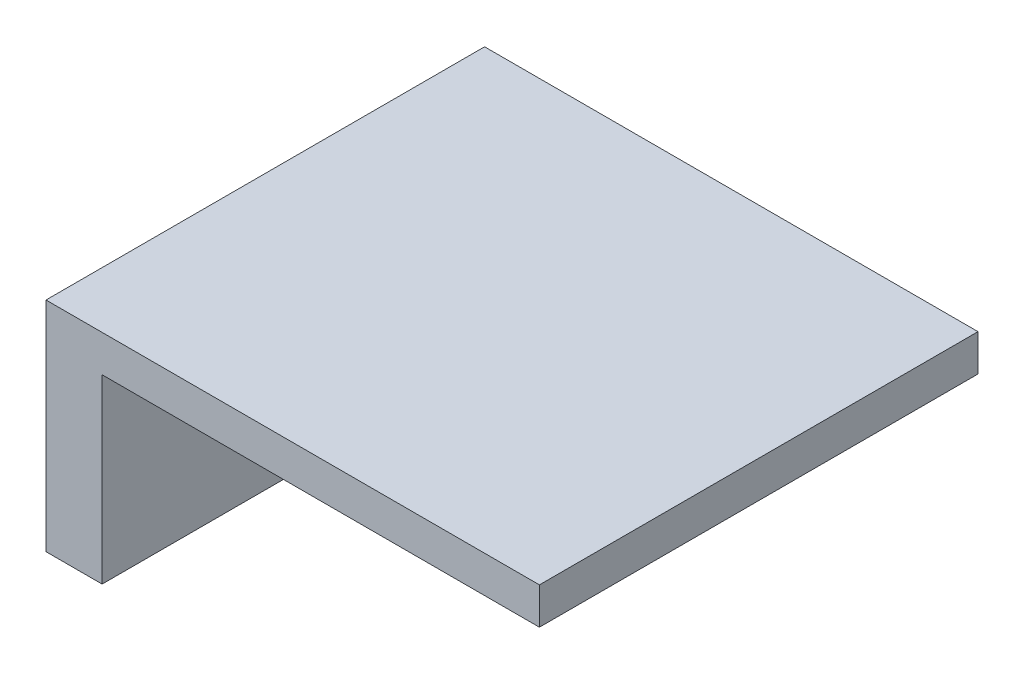
ISO-10303-21;
HEADER;
FILE_DESCRIPTION(('STEP AP214'),'2;1');
FILE_NAME('part.step','',(''),(''),'','','');
FILE_SCHEMA(('AUTOMOTIVE_DESIGN { 1 0 10303 214 1 1 1 1 }'));
ENDSEC;
DATA;
#1=APPLICATION_CONTEXT('core data for automotive mechanical design processes');
#2=APPLICATION_PROTOCOL_DEFINITION('international standard','automotive_design',2000,#1);
#3=PRODUCT_CONTEXT('',#1,'mechanical');
#4=PRODUCT('Part','Part','',(#3));
#5=PRODUCT_RELATED_PRODUCT_CATEGORY('part','',(#4));
#6=PRODUCT_DEFINITION_FORMATION('','',#4);
#7=PRODUCT_DEFINITION_CONTEXT('part definition',#1,'design');
#8=PRODUCT_DEFINITION('design','',#6,#7);
#9=PRODUCT_DEFINITION_SHAPE('','',#8);
#10=(LENGTH_UNIT() NAMED_UNIT(*) SI_UNIT(.MILLI.,.METRE.));
#11=(NAMED_UNIT(*) PLANE_ANGLE_UNIT() SI_UNIT($,.RADIAN.));
#12=(NAMED_UNIT(*) SI_UNIT($,.STERADIAN.) SOLID_ANGLE_UNIT());
#13=UNCERTAINTY_MEASURE_WITH_UNIT(LENGTH_MEASURE(1.E-05),#10,'distance_accuracy_value','');
#14=(GEOMETRIC_REPRESENTATION_CONTEXT(3) GLOBAL_UNCERTAINTY_ASSIGNED_CONTEXT((#13)) GLOBAL_UNIT_ASSIGNED_CONTEXT((#10,
#11,#12)) REPRESENTATION_CONTEXT('',''));
#15=CARTESIAN_POINT('',(0.,0.,0.));
#16=DIRECTION('',(0.,0.,1.));
#17=DIRECTION('',(1.,0.,0.));
#18=AXIS2_PLACEMENT_3D('',#15,#16,#17);
#19=CARTESIAN_POINT('',(-29.6388581562987,1.7,14.9910826968152));
#20=DIRECTION('',(1.,0.,0.));
#21=DIRECTION('',(0.,0.,-1.));
#22=AXIS2_PLACEMENT_3D('',#19,#20,#21);
#23=PLANE('',#22);
#24=DIRECTION('',(0.,-1.,0.));
#25=VECTOR('',#24,1.);
#26=CARTESIAN_POINT('',(-29.6388581562987,1.7,-5.32891730318484));
#27=LINE('',#26,#25);
#28=CARTESIAN_POINT('',(-29.6388581562987,1.7,-5.32891730318484));
#29=VERTEX_POINT('',#28);
#30=CARTESIAN_POINT('',(-29.6388581562987,-8.4,-5.32891730318484));
#31=VERTEX_POINT('',#30);
#32=EDGE_CURVE('E95',#29,#31,#27,.T.);
#33=ORIENTED_EDGE('',*,*,#32,.T.);
#34=DIRECTION('',(0.,0.,-1.));
#35=VECTOR('',#34,1.);
#36=CARTESIAN_POINT('',(-29.6388581562987,-8.4,14.9910826968152));
#37=LINE('',#36,#35);
#38=CARTESIAN_POINT('',(-29.6388581562987,-8.4,14.9910826968152));
#39=VERTEX_POINT('',#38);
#40=EDGE_CURVE('E99',#39,#31,#37,.T.);
#41=ORIENTED_EDGE('',*,*,#40,.F.);
#42=DIRECTION('',(0.,-1.,0.));
#43=VECTOR('',#42,1.);
#44=CARTESIAN_POINT('',(-29.6388581562987,1.7,14.9910826968152));
#45=LINE('',#44,#43);
#46=CARTESIAN_POINT('',(-29.6388581562987,1.7,14.9910826968152));
#47=VERTEX_POINT('',#46);
#48=EDGE_CURVE('E11',#47,#39,#45,.T.);
#49=ORIENTED_EDGE('',*,*,#48,.F.);
#50=DIRECTION('',(0.,0.,1.));
#51=VECTOR('',#50,1.);
#52=CARTESIAN_POINT('',(-29.6388581562987,1.7,14.9910826968152));
#53=LINE('',#52,#51);
#54=EDGE_CURVE('E100',#29,#47,#53,.T.);
#55=ORIENTED_EDGE('',*,*,#54,.F.);
#56=EDGE_LOOP('',(#33,#41,#49,#55));
#57=FACE_BOUND('',#56,.T.);
#58=ADVANCED_FACE('F31',(#57),#23,.F.);
#59=CARTESIAN_POINT('',(-29.6388581562987,1.7,14.9910826968152));
#60=DIRECTION('',(0.,0.,-1.));
#61=DIRECTION('',(-1.,0.,0.));
#62=AXIS2_PLACEMENT_3D('',#59,#60,#61);
#63=PLANE('',#62);
#64=ORIENTED_EDGE('',*,*,#48,.T.);
#65=DIRECTION('',(-1.,0.,0.));
#66=VECTOR('',#65,1.);
#67=CARTESIAN_POINT('',(-29.6388581562987,-8.4,14.9910826968152));
#68=LINE('',#67,#66);
#69=CARTESIAN_POINT('',(-27.0388581562987,-8.4,14.9910826968152));
#70=VERTEX_POINT('',#69);
#71=EDGE_CURVE('E116',#70,#39,#68,.T.);
#72=ORIENTED_EDGE('',*,*,#71,.F.);
#73=DIRECTION('',(0.,1.,0.));
#74=VECTOR('',#73,1.);
#75=CARTESIAN_POINT('',(-27.0388581562987,-8.4,14.9910826968152));
#76=LINE('',#75,#74);
#77=CARTESIAN_POINT('',(-27.0388581562987,0.,14.9910826968152));
#78=VERTEX_POINT('',#77);
#79=EDGE_CURVE('E122',#70,#78,#76,.T.);
#80=ORIENTED_EDGE('',*,*,#79,.T.);
#81=DIRECTION('',(1.,0.,0.));
#82=VECTOR('',#81,1.);
#83=CARTESIAN_POINT('',(-29.6388581562987,0.,14.9910826968152));
#84=LINE('',#83,#82);
#85=CARTESIAN_POINT('',(-6.77885815629872,0.,14.9910826968152));
#86=VERTEX_POINT('',#85);
#87=EDGE_CURVE('E128',#78,#86,#84,.T.);
#88=ORIENTED_EDGE('',*,*,#87,.T.);
#89=DIRECTION('',(0.,-1.,0.));
#90=VECTOR('',#89,1.);
#91=CARTESIAN_POINT('',(-6.77885815629872,1.7,14.9910826968152));
#92=LINE('',#91,#90);
#93=CARTESIAN_POINT('',(-6.77885815629872,1.7,14.9910826968152));
#94=VERTEX_POINT('',#93);
#95=EDGE_CURVE('E39',#94,#86,#92,.T.);
#96=ORIENTED_EDGE('',*,*,#95,.F.);
#97=DIRECTION('',(1.,0.,0.));
#98=VECTOR('',#97,1.);
#99=CARTESIAN_POINT('',(-29.6388581562987,1.7,14.9910826968152));
#100=LINE('',#99,#98);
#101=EDGE_CURVE('E79',#47,#94,#100,.T.);
#102=ORIENTED_EDGE('',*,*,#101,.F.);
#103=EDGE_LOOP('',(#64,#72,#80,#88,#96,#102));
#104=FACE_BOUND('',#103,.T.);
#105=ADVANCED_FACE('F147',(#104),#63,.F.);
#106=CARTESIAN_POINT('',(-6.77885815629872,1.7,14.9910826968152));
#107=DIRECTION('',(-1.,0.,0.));
#108=DIRECTION('',(0.,0.,1.));
#109=AXIS2_PLACEMENT_3D('',#106,#107,#108);
#110=PLANE('',#109);
#111=DIRECTION('',(0.,0.,-1.));
#112=VECTOR('',#111,1.);
#113=CARTESIAN_POINT('',(-6.77885815629872,0.,14.9910826968152));
#114=LINE('',#113,#112);
#115=CARTESIAN_POINT('',(-6.77885815629872,0.,-5.32891730318484));
#116=VERTEX_POINT('',#115);
#117=EDGE_CURVE('E72',#86,#116,#114,.T.);
#118=ORIENTED_EDGE('',*,*,#117,.T.);
#119=DIRECTION('',(0.,-1.,0.));
#120=VECTOR('',#119,1.);
#121=CARTESIAN_POINT('',(-6.77885815629872,1.7,-5.32891730318484));
#122=LINE('',#121,#120);
#123=CARTESIAN_POINT('',(-6.77885815629872,1.7,-5.32891730318484));
#124=VERTEX_POINT('',#123);
#125=EDGE_CURVE('E102',#124,#116,#122,.T.);
#126=ORIENTED_EDGE('',*,*,#125,.F.);
#127=DIRECTION('',(0.,0.,-1.));
#128=VECTOR('',#127,1.);
#129=CARTESIAN_POINT('',(-6.77885815629872,1.7,14.9910826968152));
#130=LINE('',#129,#128);
#131=EDGE_CURVE('E221',#94,#124,#130,.T.);
#132=ORIENTED_EDGE('',*,*,#131,.F.);
#133=ORIENTED_EDGE('',*,*,#95,.T.);
#134=EDGE_LOOP('',(#118,#126,#132,#133));
#135=FACE_BOUND('',#134,.T.);
#136=ADVANCED_FACE('F149',(#135),#110,.F.);
#137=CARTESIAN_POINT('',(-29.6388581562987,1.7,-5.32891730318484));
#138=DIRECTION('',(0.,0.,1.));
#139=DIRECTION('',(1.,0.,0.));
#140=AXIS2_PLACEMENT_3D('',#137,#138,#139);
#141=PLANE('',#140);
#142=DIRECTION('',(-1.,0.,0.));
#143=VECTOR('',#142,1.);
#144=CARTESIAN_POINT('',(-29.6388581562987,0.,-5.32891730318484));
#145=LINE('',#144,#143);
#146=CARTESIAN_POINT('',(-27.0388581562987,0.,-5.32891730318484));
#147=VERTEX_POINT('',#146);
#148=EDGE_CURVE('E135',#116,#147,#145,.T.);
#149=ORIENTED_EDGE('',*,*,#148,.T.);
#150=DIRECTION('',(0.,1.,0.));
#151=VECTOR('',#150,1.);
#152=CARTESIAN_POINT('',(-27.0388581562987,-8.4,-5.32891730318484));
#153=LINE('',#152,#151);
#154=CARTESIAN_POINT('',(-27.0388581562987,-8.4,-5.32891730318484));
#155=VERTEX_POINT('',#154);
#156=EDGE_CURVE('E108',#155,#147,#153,.T.);
#157=ORIENTED_EDGE('',*,*,#156,.F.);
#158=DIRECTION('',(1.,0.,0.));
#159=VECTOR('',#158,1.);
#160=CARTESIAN_POINT('',(-29.6388581562987,-8.4,-5.32891730318484));
#161=LINE('',#160,#159);
#162=EDGE_CURVE('E105',#31,#155,#161,.T.);
#163=ORIENTED_EDGE('',*,*,#162,.F.);
#164=ORIENTED_EDGE('',*,*,#32,.F.);
#165=DIRECTION('',(-1.,0.,0.));
#166=VECTOR('',#165,1.);
#167=CARTESIAN_POINT('',(-29.6388581562987,1.7,-5.32891730318484));
#168=LINE('',#167,#166);
#169=EDGE_CURVE('E56',#124,#29,#168,.T.);
#170=ORIENTED_EDGE('',*,*,#169,.F.);
#171=ORIENTED_EDGE('',*,*,#125,.T.);
#172=EDGE_LOOP('',(#149,#157,#163,#164,#170,#171));
#173=FACE_BOUND('',#172,.T.);
#174=ADVANCED_FACE('F106',(#173),#141,.F.);
#175=CARTESIAN_POINT('',(-29.6388581562987,1.7,-5.32891730318484));
#176=DIRECTION('',(0.,-1.,0.));
#177=DIRECTION('',(0.,0.,-1.));
#178=AXIS2_PLACEMENT_3D('',#175,#176,#177);
#179=PLANE('',#178);
#180=ORIENTED_EDGE('',*,*,#54,.T.);
#181=ORIENTED_EDGE('',*,*,#101,.T.);
#182=ORIENTED_EDGE('',*,*,#131,.T.);
#183=ORIENTED_EDGE('',*,*,#169,.T.);
#184=EDGE_LOOP('',(#180,#181,#182,#183));
#185=FACE_BOUND('',#184,.T.);
#186=ADVANCED_FACE('F158',(#185),#179,.F.);
#187=CARTESIAN_POINT('',(-29.6388581562987,0.,-5.32891730318484));
#188=DIRECTION('',(0.,-1.,0.));
#189=DIRECTION('',(0.,0.,-1.));
#190=AXIS2_PLACEMENT_3D('',#187,#188,#189);
#191=PLANE('',#190);
#192=DIRECTION('',(0.,0.,1.));
#193=VECTOR('',#192,1.);
#194=CARTESIAN_POINT('',(-27.0388581562987,0.,14.9910826968152));
#195=LINE('',#194,#193);
#196=EDGE_CURVE('E47',#147,#78,#195,.T.);
#197=ORIENTED_EDGE('',*,*,#196,.F.);
#198=ORIENTED_EDGE('',*,*,#148,.F.);
#199=ORIENTED_EDGE('',*,*,#117,.F.);
#200=ORIENTED_EDGE('',*,*,#87,.F.);
#201=EDGE_LOOP('',(#197,#198,#199,#200));
#202=FACE_BOUND('',#201,.T.);
#203=ADVANCED_FACE('F144',(#202),#191,.T.);
#204=CARTESIAN_POINT('',(-27.0388581562987,-8.4,14.9910826968152));
#205=DIRECTION('',(-1.,0.,0.));
#206=DIRECTION('',(0.,0.,1.));
#207=AXIS2_PLACEMENT_3D('',#204,#205,#206);
#208=PLANE('',#207);
#209=ORIENTED_EDGE('',*,*,#196,.T.);
#210=ORIENTED_EDGE('',*,*,#79,.F.);
#211=DIRECTION('',(0.,0.,1.));
#212=VECTOR('',#211,1.);
#213=CARTESIAN_POINT('',(-27.0388581562987,-8.4,14.9910826968152));
#214=LINE('',#213,#212);
#215=EDGE_CURVE('E111',#155,#70,#214,.T.);
#216=ORIENTED_EDGE('',*,*,#215,.F.);
#217=ORIENTED_EDGE('',*,*,#156,.T.);
#218=EDGE_LOOP('',(#209,#210,#216,#217));
#219=FACE_BOUND('',#218,.T.);
#220=ADVANCED_FACE('F146',(#219),#208,.F.);
#221=CARTESIAN_POINT('',(-29.6388581562987,-8.4,-5.32891730318484));
#222=DIRECTION('',(0.,-1.,0.));
#223=DIRECTION('',(0.,0.,-1.));
#224=AXIS2_PLACEMENT_3D('',#221,#222,#223);
#225=PLANE('',#224);
#226=ORIENTED_EDGE('',*,*,#40,.T.);
#227=ORIENTED_EDGE('',*,*,#162,.T.);
#228=ORIENTED_EDGE('',*,*,#215,.T.);
#229=ORIENTED_EDGE('',*,*,#71,.T.);
#230=EDGE_LOOP('',(#226,#227,#228,#229));
#231=FACE_BOUND('',#230,.T.);
#232=ADVANCED_FACE('F114',(#231),#225,.T.);
#233=CLOSED_SHELL('',(#58,#105,#136,#174,#186,#203,#220,#232));
#234=MANIFOLD_SOLID_BREP('B2',#233);
#235=ADVANCED_BREP_SHAPE_REPRESENTATION('',(#18,#234),#14);
#236=SHAPE_DEFINITION_REPRESENTATION(#9,#235);
ENDSEC;
END-ISO-10303-21;
